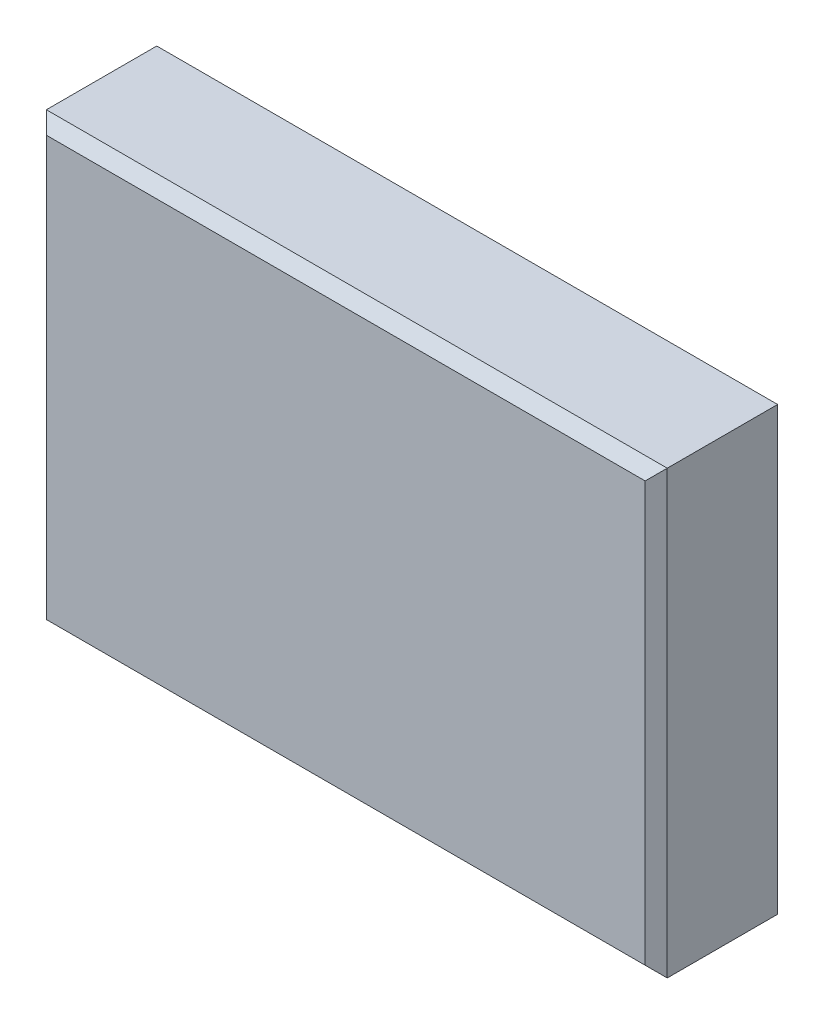
ISO-10303-21;
HEADER;
FILE_DESCRIPTION(('STEP AP214'),'2;1');
FILE_NAME('part.step','',(''),(''),'','','');
FILE_SCHEMA(('AUTOMOTIVE_DESIGN { 1 0 10303 214 1 1 1 1 }'));
ENDSEC;
DATA;
#1=APPLICATION_CONTEXT('core data for automotive mechanical design processes');
#2=APPLICATION_PROTOCOL_DEFINITION('international standard','automotive_design',2000,#1);
#3=PRODUCT_CONTEXT('',#1,'mechanical');
#4=PRODUCT('Part','Part','',(#3));
#5=PRODUCT_RELATED_PRODUCT_CATEGORY('part','',(#4));
#6=PRODUCT_DEFINITION_FORMATION('','',#4);
#7=PRODUCT_DEFINITION_CONTEXT('part definition',#1,'design');
#8=PRODUCT_DEFINITION('design','',#6,#7);
#9=PRODUCT_DEFINITION_SHAPE('','',#8);
#10=(LENGTH_UNIT() NAMED_UNIT(*) SI_UNIT(.MILLI.,.METRE.));
#11=(NAMED_UNIT(*) PLANE_ANGLE_UNIT() SI_UNIT($,.RADIAN.));
#12=(NAMED_UNIT(*) SI_UNIT($,.STERADIAN.) SOLID_ANGLE_UNIT());
#13=UNCERTAINTY_MEASURE_WITH_UNIT(LENGTH_MEASURE(1.E-05),#10,'distance_accuracy_value','');
#14=(GEOMETRIC_REPRESENTATION_CONTEXT(3) GLOBAL_UNCERTAINTY_ASSIGNED_CONTEXT((#13)) GLOBAL_UNIT_ASSIGNED_CONTEXT((#10,
#11,#12)) REPRESENTATION_CONTEXT('',''));
#15=CARTESIAN_POINT('',(0.,0.,0.));
#16=DIRECTION('',(0.,0.,1.));
#17=DIRECTION('',(1.,0.,0.));
#18=AXIS2_PLACEMENT_3D('',#15,#16,#17);
#19=CARTESIAN_POINT('',(2.21,-1.6,0.86));
#20=DIRECTION('',(0.707106781186548,0.,0.707106781186548));
#21=DIRECTION('',(0.,-1.,0.));
#22=AXIS2_PLACEMENT_3D('',#19,#20,#21);
#23=PLANE('',#22);
#24=DIRECTION('',(-0.577350269189626,0.577350269189626,0.577350269189626));
#25=VECTOR('',#24,1.);
#26=CARTESIAN_POINT('',(1.473333333333,-0.823333333333,1.596666666667));
#27=LINE('',#26,#25);
#28=CARTESIAN_POINT('',(2.25,-1.6,0.82));
#29=VERTEX_POINT('',#28);
#30=CARTESIAN_POINT('',(2.17,-1.52,0.9));
#31=VERTEX_POINT('',#30);
#32=EDGE_CURVE('E87',#29,#31,#27,.T.);
#33=ORIENTED_EDGE('',*,*,#32,.F.);
#34=DIRECTION('',(0.,1.,0.));
#35=VECTOR('',#34,1.);
#36=CARTESIAN_POINT('',(2.25,-1.6,0.82));
#37=LINE('',#36,#35);
#38=CARTESIAN_POINT('',(2.25,1.6,0.82));
#39=VERTEX_POINT('',#38);
#40=EDGE_CURVE('E85',#29,#39,#37,.T.);
#41=ORIENTED_EDGE('',*,*,#40,.T.);
#42=DIRECTION('',(-0.577350269189626,-0.577350269189626,0.577350269189626));
#43=VECTOR('',#42,1.);
#44=CARTESIAN_POINT('',(0.94,0.29,2.13));
#45=LINE('',#44,#43);
#46=CARTESIAN_POINT('',(2.17,1.52,0.9));
#47=VERTEX_POINT('',#46);
#48=EDGE_CURVE('E11',#39,#47,#45,.T.);
#49=ORIENTED_EDGE('',*,*,#48,.T.);
#50=DIRECTION('',(0.,1.,0.));
#51=VECTOR('',#50,1.);
#52=CARTESIAN_POINT('',(2.17,-1.6,0.9));
#53=LINE('',#52,#51);
#54=EDGE_CURVE('E120',#31,#47,#53,.T.);
#55=ORIENTED_EDGE('',*,*,#54,.F.);
#56=EDGE_LOOP('',(#33,#41,#49,#55));
#57=FACE_BOUND('',#56,.T.);
#58=ADVANCED_FACE('F17',(#57),#23,.T.);
#59=CARTESIAN_POINT('',(-2.25,1.56,0.86));
#60=DIRECTION('',(0.,0.707106781186548,0.707106781186548));
#61=DIRECTION('',(1.,0.,0.));
#62=AXIS2_PLACEMENT_3D('',#59,#60,#61);
#63=PLANE('',#62);
#64=DIRECTION('',(1.,0.,0.));
#65=VECTOR('',#64,1.);
#66=CARTESIAN_POINT('',(-2.25,1.52,0.9));
#67=LINE('',#66,#65);
#68=CARTESIAN_POINT('',(-2.17,1.52,0.9));
#69=VERTEX_POINT('',#68);
#70=EDGE_CURVE('E26',#69,#47,#67,.T.);
#71=ORIENTED_EDGE('',*,*,#70,.T.);
#72=ORIENTED_EDGE('',*,*,#48,.F.);
#73=DIRECTION('',(1.,0.,0.));
#74=VECTOR('',#73,1.);
#75=CARTESIAN_POINT('',(-2.25,1.6,0.82));
#76=LINE('',#75,#74);
#77=CARTESIAN_POINT('',(-2.25,1.6,0.82));
#78=VERTEX_POINT('',#77);
#79=EDGE_CURVE('E81',#78,#39,#76,.T.);
#80=ORIENTED_EDGE('',*,*,#79,.F.);
#81=DIRECTION('',(0.577350269189626,-0.577350269189626,0.577350269189626));
#82=VECTOR('',#81,1.);
#83=CARTESIAN_POINT('',(-1.69,1.04,1.38));
#84=LINE('',#83,#82);
#85=EDGE_CURVE('E252',#78,#69,#84,.T.);
#86=ORIENTED_EDGE('',*,*,#85,.T.);
#87=EDGE_LOOP('',(#71,#72,#80,#86));
#88=FACE_BOUND('',#87,.T.);
#89=ADVANCED_FACE('F78',(#88),#63,.T.);
#90=CARTESIAN_POINT('',(-2.25,-1.6,0.9));
#91=DIRECTION('',(0.,0.,1.));
#92=DIRECTION('',(1.,0.,0.));
#93=AXIS2_PLACEMENT_3D('',#90,#91,#92);
#94=PLANE('',#93);
#95=DIRECTION('',(1.,0.,0.));
#96=VECTOR('',#95,1.);
#97=CARTESIAN_POINT('',(-2.25,-1.52,0.9));
#98=LINE('',#97,#96);
#99=CARTESIAN_POINT('',(-2.17,-1.52,0.9));
#100=VERTEX_POINT('',#99);
#101=EDGE_CURVE('E116',#100,#31,#98,.T.);
#102=ORIENTED_EDGE('',*,*,#101,.T.);
#103=ORIENTED_EDGE('',*,*,#54,.T.);
#104=ORIENTED_EDGE('',*,*,#70,.F.);
#105=DIRECTION('',(0.,1.,0.));
#106=VECTOR('',#105,1.);
#107=CARTESIAN_POINT('',(-2.17,-1.6,0.9));
#108=LINE('',#107,#106);
#109=EDGE_CURVE('E225',#100,#69,#108,.T.);
#110=ORIENTED_EDGE('',*,*,#109,.F.);
#111=EDGE_LOOP('',(#102,#103,#104,#110));
#112=FACE_BOUND('',#111,.T.);
#113=ADVANCED_FACE('F185',(#112),#94,.T.);
#114=CARTESIAN_POINT('',(-2.25,-1.56,0.86));
#115=DIRECTION('',(0.,0.707106781186548,-0.707106781186548));
#116=DIRECTION('',(-1.,0.,0.));
#117=AXIS2_PLACEMENT_3D('',#114,#115,#116);
#118=PLANE('',#117);
#119=DIRECTION('',(0.577350269189626,0.577350269189626,0.577350269189626));
#120=VECTOR('',#119,1.);
#121=CARTESIAN_POINT('',(-2.223333333333,-1.573333333333,0.846666666667));
#122=LINE('',#121,#120);
#123=CARTESIAN_POINT('',(-2.25,-1.6,0.82));
#124=VERTEX_POINT('',#123);
#125=EDGE_CURVE('E230',#124,#100,#122,.T.);
#126=ORIENTED_EDGE('',*,*,#125,.F.);
#127=DIRECTION('',(1.,0.,0.));
#128=VECTOR('',#127,1.);
#129=CARTESIAN_POINT('',(-2.25,-1.6,0.82));
#130=LINE('',#129,#128);
#131=EDGE_CURVE('E229',#124,#29,#130,.T.);
#132=ORIENTED_EDGE('',*,*,#131,.T.);
#133=ORIENTED_EDGE('',*,*,#32,.T.);
#134=ORIENTED_EDGE('',*,*,#101,.F.);
#135=EDGE_LOOP('',(#126,#132,#133,#134));
#136=FACE_BOUND('',#135,.T.);
#137=ADVANCED_FACE('F177',(#136),#118,.F.);
#138=CARTESIAN_POINT('',(2.25,-1.6,0.02));
#139=DIRECTION('',(1.,0.,0.));
#140=DIRECTION('',(0.,1.,0.));
#141=AXIS2_PLACEMENT_3D('',#138,#139,#140);
#142=PLANE('',#141);
#143=DIRECTION('',(0.,0.,1.));
#144=VECTOR('',#143,1.);
#145=CARTESIAN_POINT('',(2.25,-1.6,0.02));
#146=LINE('',#145,#144);
#147=CARTESIAN_POINT('',(2.25,-1.6,0.02));
#148=VERTEX_POINT('',#147);
#149=EDGE_CURVE('E242',#148,#29,#146,.T.);
#150=ORIENTED_EDGE('',*,*,#149,.F.);
#151=DIRECTION('',(0.,1.,0.));
#152=VECTOR('',#151,1.);
#153=CARTESIAN_POINT('',(2.25,-1.6,0.02));
#154=LINE('',#153,#152);
#155=CARTESIAN_POINT('',(2.25,1.6,0.02));
#156=VERTEX_POINT('',#155);
#157=EDGE_CURVE('E105',#148,#156,#154,.T.);
#158=ORIENTED_EDGE('',*,*,#157,.T.);
#159=DIRECTION('',(0.,0.,1.));
#160=VECTOR('',#159,1.);
#161=CARTESIAN_POINT('',(2.25,1.6,0.02));
#162=LINE('',#161,#160);
#163=EDGE_CURVE('E97',#156,#39,#162,.T.);
#164=ORIENTED_EDGE('',*,*,#163,.T.);
#165=ORIENTED_EDGE('',*,*,#40,.F.);
#166=EDGE_LOOP('',(#150,#158,#164,#165));
#167=FACE_BOUND('',#166,.T.);
#168=ADVANCED_FACE('F104',(#167),#142,.T.);
#169=CARTESIAN_POINT('',(-2.25,1.6,0.02));
#170=DIRECTION('',(0.,1.,0.));
#171=DIRECTION('',(1.,0.,0.));
#172=AXIS2_PLACEMENT_3D('',#169,#170,#171);
#173=PLANE('',#172);
#174=ORIENTED_EDGE('',*,*,#163,.F.);
#175=DIRECTION('',(1.,0.,0.));
#176=VECTOR('',#175,1.);
#177=CARTESIAN_POINT('',(-2.25,1.6,0.02));
#178=LINE('',#177,#176);
#179=CARTESIAN_POINT('',(-2.25,1.6,0.02));
#180=VERTEX_POINT('',#179);
#181=EDGE_CURVE('E112',#180,#156,#178,.T.);
#182=ORIENTED_EDGE('',*,*,#181,.F.);
#183=DIRECTION('',(0.,0.,1.));
#184=VECTOR('',#183,1.);
#185=CARTESIAN_POINT('',(-2.25,1.6,0.02));
#186=LINE('',#185,#184);
#187=EDGE_CURVE('E100',#180,#78,#186,.T.);
#188=ORIENTED_EDGE('',*,*,#187,.T.);
#189=ORIENTED_EDGE('',*,*,#79,.T.);
#190=EDGE_LOOP('',(#174,#182,#188,#189));
#191=FACE_BOUND('',#190,.T.);
#192=ADVANCED_FACE('F96',(#191),#173,.T.);
#193=CARTESIAN_POINT('',(-2.25,-1.6,0.02));
#194=DIRECTION('',(0.,0.,1.));
#195=DIRECTION('',(1.,0.,0.));
#196=AXIS2_PLACEMENT_3D('',#193,#194,#195);
#197=PLANE('',#196);
#198=ORIENTED_EDGE('',*,*,#181,.T.);
#199=ORIENTED_EDGE('',*,*,#157,.F.);
#200=DIRECTION('',(1.,0.,0.));
#201=VECTOR('',#200,1.);
#202=CARTESIAN_POINT('',(-2.25,-1.6,0.02));
#203=LINE('',#202,#201);
#204=CARTESIAN_POINT('',(-2.25,-1.6,0.02));
#205=VERTEX_POINT('',#204);
#206=EDGE_CURVE('E234',#205,#148,#203,.T.);
#207=ORIENTED_EDGE('',*,*,#206,.F.);
#208=DIRECTION('',(0.,1.,0.));
#209=VECTOR('',#208,1.);
#210=CARTESIAN_POINT('',(-2.25,-1.6,0.02));
#211=LINE('',#210,#209);
#212=EDGE_CURVE('E245',#205,#180,#211,.T.);
#213=ORIENTED_EDGE('',*,*,#212,.T.);
#214=EDGE_LOOP('',(#198,#199,#207,#213));
#215=FACE_BOUND('',#214,.T.);
#216=ADVANCED_FACE('F153',(#215),#197,.F.);
#217=CARTESIAN_POINT('',(-2.21,-1.6,0.86));
#218=DIRECTION('',(0.707106781186548,0.,-0.707106781186548));
#219=DIRECTION('',(0.,-1.,0.));
#220=AXIS2_PLACEMENT_3D('',#217,#218,#219);
#221=PLANE('',#220);
#222=ORIENTED_EDGE('',*,*,#109,.T.);
#223=ORIENTED_EDGE('',*,*,#85,.F.);
#224=DIRECTION('',(0.,1.,0.));
#225=VECTOR('',#224,1.);
#226=CARTESIAN_POINT('',(-2.25,-1.6,0.82));
#227=LINE('',#226,#225);
#228=EDGE_CURVE('E251',#124,#78,#227,.T.);
#229=ORIENTED_EDGE('',*,*,#228,.F.);
#230=ORIENTED_EDGE('',*,*,#125,.T.);
#231=EDGE_LOOP('',(#222,#223,#229,#230));
#232=FACE_BOUND('',#231,.T.);
#233=ADVANCED_FACE('F144',(#232),#221,.F.);
#234=CARTESIAN_POINT('',(-2.25,-1.6,0.02));
#235=DIRECTION('',(0.,1.,0.));
#236=DIRECTION('',(1.,0.,0.));
#237=AXIS2_PLACEMENT_3D('',#234,#235,#236);
#238=PLANE('',#237);
#239=ORIENTED_EDGE('',*,*,#131,.F.);
#240=DIRECTION('',(0.,0.,1.));
#241=VECTOR('',#240,1.);
#242=CARTESIAN_POINT('',(-2.25,-1.6,0.02));
#243=LINE('',#242,#241);
#244=EDGE_CURVE('E235',#205,#124,#243,.T.);
#245=ORIENTED_EDGE('',*,*,#244,.F.);
#246=ORIENTED_EDGE('',*,*,#206,.T.);
#247=ORIENTED_EDGE('',*,*,#149,.T.);
#248=EDGE_LOOP('',(#239,#245,#246,#247));
#249=FACE_BOUND('',#248,.T.);
#250=ADVANCED_FACE('F134',(#249),#238,.F.);
#251=CARTESIAN_POINT('',(-2.25,-1.6,0.02));
#252=DIRECTION('',(1.,0.,0.));
#253=DIRECTION('',(0.,1.,0.));
#254=AXIS2_PLACEMENT_3D('',#251,#252,#253);
#255=PLANE('',#254);
#256=ORIENTED_EDGE('',*,*,#228,.T.);
#257=ORIENTED_EDGE('',*,*,#187,.F.);
#258=ORIENTED_EDGE('',*,*,#212,.F.);
#259=ORIENTED_EDGE('',*,*,#244,.T.);
#260=EDGE_LOOP('',(#256,#257,#258,#259));
#261=FACE_BOUND('',#260,.T.);
#262=ADVANCED_FACE('F129',(#261),#255,.F.);
#263=CLOSED_SHELL('',(#58,#89,#113,#137,#168,#192,#216,#233,#250,#262));
#264=MANIFOLD_SOLID_BREP('B1',#263);
#265=ADVANCED_BREP_SHAPE_REPRESENTATION('',(#18,#264),#14);
#266=SHAPE_DEFINITION_REPRESENTATION(#9,#265);
ENDSEC;
END-ISO-10303-21;
